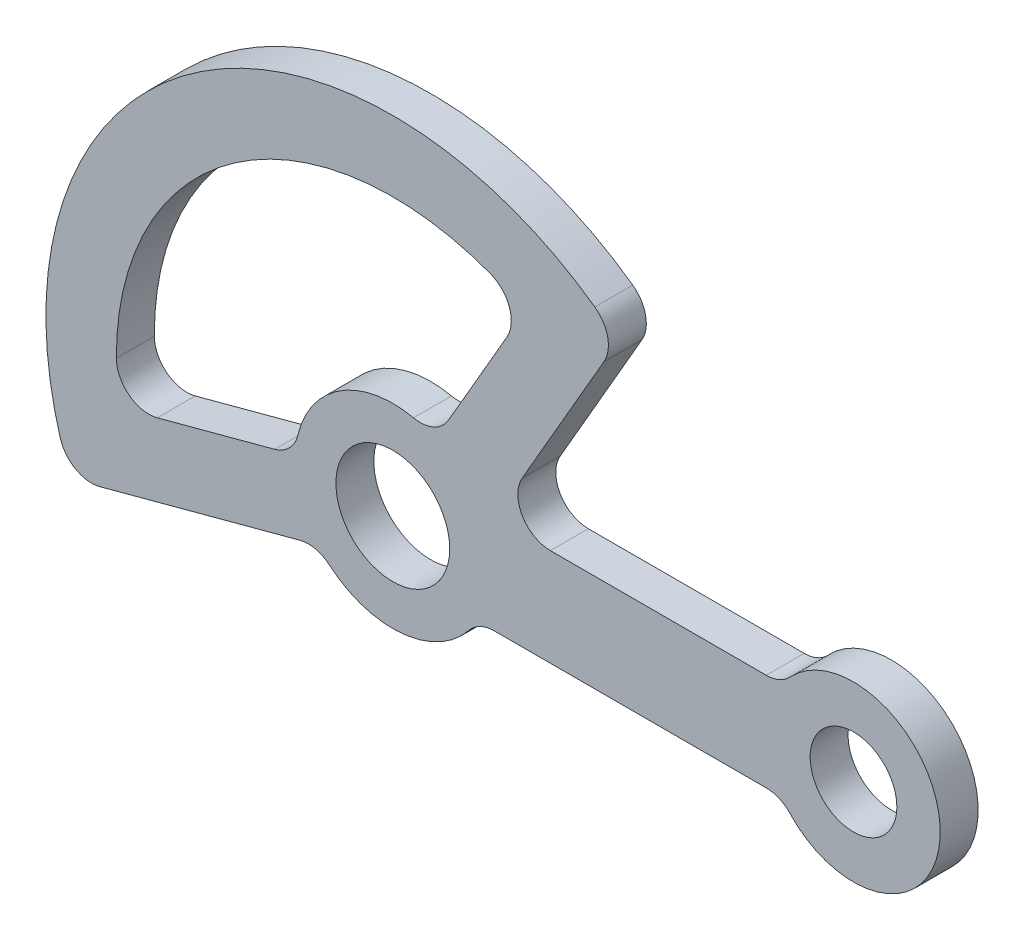
ISO-10303-21;
HEADER;
FILE_DESCRIPTION(('STEP AP214'),'2;1');
FILE_NAME('part.step','',(''),(''),'','','');
FILE_SCHEMA(('AUTOMOTIVE_DESIGN { 1 0 10303 214 1 1 1 1 }'));
ENDSEC;
DATA;
#1=APPLICATION_CONTEXT('core data for automotive mechanical design processes');
#2=APPLICATION_PROTOCOL_DEFINITION('international standard','automotive_design',2000,#1);
#3=PRODUCT_CONTEXT('',#1,'mechanical');
#4=PRODUCT('Part','Part','',(#3));
#5=PRODUCT_RELATED_PRODUCT_CATEGORY('part','',(#4));
#6=PRODUCT_DEFINITION_FORMATION('','',#4);
#7=PRODUCT_DEFINITION_CONTEXT('part definition',#1,'design');
#8=PRODUCT_DEFINITION('design','',#6,#7);
#9=PRODUCT_DEFINITION_SHAPE('','',#8);
#10=(LENGTH_UNIT() NAMED_UNIT(*) SI_UNIT(.MILLI.,.METRE.));
#11=(NAMED_UNIT(*) PLANE_ANGLE_UNIT() SI_UNIT($,.RADIAN.));
#12=(NAMED_UNIT(*) SI_UNIT($,.STERADIAN.) SOLID_ANGLE_UNIT());
#13=UNCERTAINTY_MEASURE_WITH_UNIT(LENGTH_MEASURE(1.E-05),#10,'distance_accuracy_value','');
#14=(GEOMETRIC_REPRESENTATION_CONTEXT(3) GLOBAL_UNCERTAINTY_ASSIGNED_CONTEXT((#13)) GLOBAL_UNIT_ASSIGNED_CONTEXT((#10,
#11,#12)) REPRESENTATION_CONTEXT('',''));
#15=CARTESIAN_POINT('',(0.,0.,0.));
#16=DIRECTION('',(0.,0.,1.));
#17=DIRECTION('',(1.,0.,0.));
#18=AXIS2_PLACEMENT_3D('',#15,#16,#17);
#19=CARTESIAN_POINT('',(0.,0.,7.));
#20=DIRECTION('',(0.,0.,-1.));
#21=DIRECTION('',(-1.,0.,0.));
#22=AXIS2_PLACEMENT_3D('',#19,#20,#21);
#23=CYLINDRICAL_SURFACE('',#22,18.);
#24=CARTESIAN_POINT('',(0.,0.,0.));
#25=DIRECTION('',(0.,0.,1.));
#26=DIRECTION('',(1.,0.,0.));
#27=AXIS2_PLACEMENT_3D('',#24,#25,#26);
#28=CIRCLE('',#27,18.);
#29=CARTESIAN_POINT('',(-11.689775819506,-13.6875542479178,0.));
#30=VERTEX_POINT('',#29);
#31=CARTESIAN_POINT('',(14.0512454963964,-11.25,0.));
#32=VERTEX_POINT('',#31);
#33=EDGE_CURVE('E251',#30,#32,#28,.T.);
#34=ORIENTED_EDGE('',*,*,#33,.T.);
#35=DIRECTION('',(0.,0.,-1.));
#36=VECTOR('',#35,1.);
#37=CARTESIAN_POINT('',(14.0512454963964,-11.25,7.));
#38=LINE('',#37,#36);
#39=CARTESIAN_POINT('',(14.0512454963964,-11.25,7.));
#40=VERTEX_POINT('',#39);
#41=EDGE_CURVE('E11',#40,#32,#38,.T.);
#42=ORIENTED_EDGE('',*,*,#41,.F.);
#43=CARTESIAN_POINT('',(0.,0.,7.));
#44=DIRECTION('',(0.,0.,1.));
#45=DIRECTION('',(1.,0.,0.));
#46=AXIS2_PLACEMENT_3D('',#43,#44,#45);
#47=CIRCLE('',#46,18.);
#48=CARTESIAN_POINT('',(-11.689775819506,-13.6875542479178,7.));
#49=VERTEX_POINT('',#48);
#50=EDGE_CURVE('E431',#49,#40,#47,.T.);
#51=ORIENTED_EDGE('',*,*,#50,.F.);
#52=DIRECTION('',(0.,0.,-1.));
#53=VECTOR('',#52,1.);
#54=CARTESIAN_POINT('',(-11.689775819506,-13.6875542479178,7.));
#55=LINE('',#54,#53);
#56=EDGE_CURVE('E323',#49,#30,#55,.T.);
#57=ORIENTED_EDGE('',*,*,#56,.T.);
#58=EDGE_LOOP('',(#34,#42,#51,#57));
#59=FACE_BOUND('',#58,.T.);
#60=ADVANCED_FACE('F45',(#59),#23,.T.);
#61=CARTESIAN_POINT('',(18.7349939951952,-15.,7.));
#62=DIRECTION('',(0.,0.,-1.));
#63=DIRECTION('',(-1.,0.,0.));
#64=AXIS2_PLACEMENT_3D('',#61,#62,#63);
#65=CYLINDRICAL_SURFACE('',#64,6.);
#66=CARTESIAN_POINT('',(18.7349939951952,-15.,0.));
#67=DIRECTION('',(0.,0.,1.));
#68=DIRECTION('',(1.,0.,0.));
#69=AXIS2_PLACEMENT_3D('',#66,#67,#68);
#70=CIRCLE('',#69,6.);
#71=CARTESIAN_POINT('',(18.7349939951952,-9.,0.));
#72=VERTEX_POINT('',#71);
#73=EDGE_CURVE('E274',#72,#32,#70,.T.);
#74=ORIENTED_EDGE('',*,*,#73,.F.);
#75=DIRECTION('',(0.,0.,-1.));
#76=VECTOR('',#75,1.);
#77=CARTESIAN_POINT('',(18.7349939951952,-9.,7.));
#78=LINE('',#77,#76);
#79=CARTESIAN_POINT('',(18.7349939951952,-9.,7.));
#80=VERTEX_POINT('',#79);
#81=EDGE_CURVE('E56',#80,#72,#78,.T.);
#82=ORIENTED_EDGE('',*,*,#81,.F.);
#83=CARTESIAN_POINT('',(18.7349939951952,-15.,7.));
#84=DIRECTION('',(0.,0.,1.));
#85=DIRECTION('',(1.,0.,0.));
#86=AXIS2_PLACEMENT_3D('',#83,#84,#85);
#87=CIRCLE('',#86,6.);
#88=EDGE_CURVE('E443',#80,#40,#87,.T.);
#89=ORIENTED_EDGE('',*,*,#88,.T.);
#90=ORIENTED_EDGE('',*,*,#41,.T.);
#91=EDGE_LOOP('',(#74,#82,#89,#90));
#92=FACE_BOUND('',#91,.T.);
#93=ADVANCED_FACE('F482',(#92),#65,.F.);
#94=CARTESIAN_POINT('',(0.,-9.,7.));
#95=DIRECTION('',(0.,1.,0.));
#96=DIRECTION('',(-1.,0.,0.));
#97=AXIS2_PLACEMENT_3D('',#94,#95,#96);
#98=PLANE('',#97);
#99=DIRECTION('',(1.,0.,0.));
#100=VECTOR('',#99,1.);
#101=CARTESIAN_POINT('',(0.,-9.,0.));
#102=LINE('',#101,#100);
#103=CARTESIAN_POINT('',(68.9065230605689,-9.,0.));
#104=VERTEX_POINT('',#103);
#105=EDGE_CURVE('E278',#72,#104,#102,.T.);
#106=ORIENTED_EDGE('',*,*,#105,.T.);
#107=DIRECTION('',(0.,0.,-1.));
#108=VECTOR('',#107,1.);
#109=CARTESIAN_POINT('',(68.9065230605689,-9.,7.));
#110=LINE('',#109,#108);
#111=CARTESIAN_POINT('',(68.9065230605689,-9.,7.));
#112=VERTEX_POINT('',#111);
#113=EDGE_CURVE('E355',#112,#104,#110,.T.);
#114=ORIENTED_EDGE('',*,*,#113,.F.);
#115=DIRECTION('',(1.,0.,0.));
#116=VECTOR('',#115,1.);
#117=CARTESIAN_POINT('',(0.,-9.,7.));
#118=LINE('',#117,#116);
#119=EDGE_CURVE('E447',#80,#112,#118,.T.);
#120=ORIENTED_EDGE('',*,*,#119,.F.);
#121=ORIENTED_EDGE('',*,*,#81,.T.);
#122=EDGE_LOOP('',(#106,#114,#120,#121));
#123=FACE_BOUND('',#122,.T.);
#124=ADVANCED_FACE('F487',(#123),#98,.F.);
#125=CARTESIAN_POINT('',(68.9065230605689,-15.,7.));
#126=DIRECTION('',(0.,0.,-1.));
#127=DIRECTION('',(-1.,0.,0.));
#128=AXIS2_PLACEMENT_3D('',#125,#126,#127);
#129=CYLINDRICAL_SURFACE('',#128,6.);
#130=CARTESIAN_POINT('',(68.9065230605689,-15.,0.));
#131=DIRECTION('',(0.,0.,1.));
#132=DIRECTION('',(1.,0.,0.));
#133=AXIS2_PLACEMENT_3D('',#130,#131,#132);
#134=CIRCLE('',#133,6.);
#135=CARTESIAN_POINT('',(73.2956531349592,-10.9090909090909,0.));
#136=VERTEX_POINT('',#135);
#137=EDGE_CURVE('E281',#104,#136,#134,.F.);
#138=ORIENTED_EDGE('',*,*,#137,.T.);
#139=DIRECTION('',(0.,0.,-1.));
#140=VECTOR('',#139,1.);
#141=CARTESIAN_POINT('',(73.2956531349592,-10.9090909090909,7.));
#142=LINE('',#141,#140);
#143=CARTESIAN_POINT('',(73.2956531349592,-10.9090909090909,7.));
#144=VERTEX_POINT('',#143);
#145=EDGE_CURVE('E351',#144,#136,#142,.T.);
#146=ORIENTED_EDGE('',*,*,#145,.F.);
#147=CARTESIAN_POINT('',(68.9065230605689,-15.,7.));
#148=DIRECTION('',(0.,0.,1.));
#149=DIRECTION('',(1.,0.,0.));
#150=AXIS2_PLACEMENT_3D('',#147,#148,#149);
#151=CIRCLE('',#150,6.);
#152=EDGE_CURVE('E450',#112,#144,#151,.F.);
#153=ORIENTED_EDGE('',*,*,#152,.F.);
#154=ORIENTED_EDGE('',*,*,#113,.T.);
#155=EDGE_LOOP('',(#138,#146,#153,#154));
#156=FACE_BOUND('',#155,.T.);
#157=ADVANCED_FACE('F494',(#156),#129,.F.);
#158=CARTESIAN_POINT('',(85.,0.,7.));
#159=DIRECTION('',(0.,0.,-1.));
#160=DIRECTION('',(-1.,0.,0.));
#161=AXIS2_PLACEMENT_3D('',#158,#159,#160);
#162=CYLINDRICAL_SURFACE('',#161,16.);
#163=CARTESIAN_POINT('',(85.,0.,0.));
#164=DIRECTION('',(0.,0.,1.));
#165=DIRECTION('',(1.,0.,0.));
#166=AXIS2_PLACEMENT_3D('',#163,#164,#165);
#167=CIRCLE('',#166,16.);
#168=CARTESIAN_POINT('',(73.2956531349592,10.9090909090909,0.));
#169=VERTEX_POINT('',#168);
#170=EDGE_CURVE('E284',#136,#169,#167,.T.);
#171=ORIENTED_EDGE('',*,*,#170,.T.);
#172=DIRECTION('',(0.,0.,-1.));
#173=VECTOR('',#172,1.);
#174=CARTESIAN_POINT('',(73.2956531349592,10.9090909090909,7.));
#175=LINE('',#174,#173);
#176=CARTESIAN_POINT('',(73.2956531349592,10.9090909090909,7.));
#177=VERTEX_POINT('',#176);
#178=EDGE_CURVE('E348',#177,#169,#175,.T.);
#179=ORIENTED_EDGE('',*,*,#178,.F.);
#180=CARTESIAN_POINT('',(85.,0.,7.));
#181=DIRECTION('',(0.,0.,1.));
#182=DIRECTION('',(1.,0.,0.));
#183=AXIS2_PLACEMENT_3D('',#180,#181,#182);
#184=CIRCLE('',#183,16.);
#185=EDGE_CURVE('E453',#144,#177,#184,.T.);
#186=ORIENTED_EDGE('',*,*,#185,.F.);
#187=ORIENTED_EDGE('',*,*,#145,.T.);
#188=EDGE_LOOP('',(#171,#179,#186,#187));
#189=FACE_BOUND('',#188,.T.);
#190=ADVANCED_FACE('F498',(#189),#162,.T.);
#191=CARTESIAN_POINT('',(68.9065230605689,15.,7.));
#192=DIRECTION('',(0.,0.,-1.));
#193=DIRECTION('',(-1.,0.,0.));
#194=AXIS2_PLACEMENT_3D('',#191,#192,#193);
#195=CYLINDRICAL_SURFACE('',#194,6.00000000000001);
#196=CARTESIAN_POINT('',(68.9065230605689,15.,0.));
#197=DIRECTION('',(0.,0.,1.));
#198=DIRECTION('',(1.,0.,0.));
#199=AXIS2_PLACEMENT_3D('',#196,#197,#198);
#200=CIRCLE('',#199,6.00000000000001);
#201=CARTESIAN_POINT('',(68.9065230605689,9.,0.));
#202=VERTEX_POINT('',#201);
#203=EDGE_CURVE('E288',#202,#169,#200,.T.);
#204=ORIENTED_EDGE('',*,*,#203,.F.);
#205=DIRECTION('',(0.,0.,-1.));
#206=VECTOR('',#205,1.);
#207=CARTESIAN_POINT('',(68.9065230605689,9.,7.));
#208=LINE('',#207,#206);
#209=CARTESIAN_POINT('',(68.9065230605689,9.,7.));
#210=VERTEX_POINT('',#209);
#211=EDGE_CURVE('E345',#210,#202,#208,.T.);
#212=ORIENTED_EDGE('',*,*,#211,.F.);
#213=CARTESIAN_POINT('',(68.9065230605689,15.,7.));
#214=DIRECTION('',(0.,0.,1.));
#215=DIRECTION('',(1.,0.,0.));
#216=AXIS2_PLACEMENT_3D('',#213,#214,#215);
#217=CIRCLE('',#216,6.00000000000001);
#218=EDGE_CURVE('E456',#210,#177,#217,.T.);
#219=ORIENTED_EDGE('',*,*,#218,.T.);
#220=ORIENTED_EDGE('',*,*,#178,.T.);
#221=EDGE_LOOP('',(#204,#212,#219,#220));
#222=FACE_BOUND('',#221,.T.);
#223=ADVANCED_FACE('F501',(#222),#195,.F.);
#224=CARTESIAN_POINT('',(0.,9.,7.));
#225=DIRECTION('',(0.,1.,0.));
#226=DIRECTION('',(-1.,0.,0.));
#227=AXIS2_PLACEMENT_3D('',#224,#225,#226);
#228=PLANE('',#227);
#229=DIRECTION('',(1.,0.,0.));
#230=VECTOR('',#229,1.);
#231=CARTESIAN_POINT('',(0.,9.,0.));
#232=LINE('',#231,#230);
#233=CARTESIAN_POINT('',(29.0715098264214,9.,0.));
#234=VERTEX_POINT('',#233);
#235=EDGE_CURVE('E292',#234,#202,#232,.T.);
#236=ORIENTED_EDGE('',*,*,#235,.F.);
#237=DIRECTION('',(0.,0.,-1.));
#238=VECTOR('',#237,1.);
#239=CARTESIAN_POINT('',(29.0715098264214,9.,7.));
#240=LINE('',#239,#238);
#241=CARTESIAN_POINT('',(29.0715098264214,9.,7.));
#242=VERTEX_POINT('',#241);
#243=EDGE_CURVE('E342',#242,#234,#240,.T.);
#244=ORIENTED_EDGE('',*,*,#243,.F.);
#245=DIRECTION('',(1.,0.,0.));
#246=VECTOR('',#245,1.);
#247=CARTESIAN_POINT('',(0.,9.,7.));
#248=LINE('',#247,#246);
#249=EDGE_CURVE('E460',#242,#210,#248,.T.);
#250=ORIENTED_EDGE('',*,*,#249,.T.);
#251=ORIENTED_EDGE('',*,*,#211,.T.);
#252=EDGE_LOOP('',(#236,#244,#250,#251));
#253=FACE_BOUND('',#252,.T.);
#254=ADVANCED_FACE('F505',(#253),#228,.T.);
#255=CARTESIAN_POINT('',(29.0715098264214,15.,7.));
#256=DIRECTION('',(0.,0.,-1.));
#257=DIRECTION('',(-1.,0.,0.));
#258=AXIS2_PLACEMENT_3D('',#255,#256,#257);
#259=CYLINDRICAL_SURFACE('',#258,5.99999999999997);
#260=CARTESIAN_POINT('',(29.0715098264214,15.,0.));
#261=DIRECTION('',(0.,0.,1.));
#262=DIRECTION('',(1.,0.,0.));
#263=AXIS2_PLACEMENT_3D('',#260,#261,#262);
#264=CIRCLE('',#263,5.99999999999997);
#265=CARTESIAN_POINT('',(23.8753574037148,18.,0.));
#266=VERTEX_POINT('',#265);
#267=EDGE_CURVE('E296',#234,#266,#264,.F.);
#268=ORIENTED_EDGE('',*,*,#267,.T.);
#269=DIRECTION('',(0.,0.,-1.));
#270=VECTOR('',#269,1.);
#271=CARTESIAN_POINT('',(23.8753574037148,18.,7.));
#272=LINE('',#271,#270);
#273=CARTESIAN_POINT('',(23.8753574037148,18.,7.));
#274=VERTEX_POINT('',#273);
#275=EDGE_CURVE('E338',#274,#266,#272,.T.);
#276=ORIENTED_EDGE('',*,*,#275,.F.);
#277=CARTESIAN_POINT('',(29.0715098264214,15.,7.));
#278=DIRECTION('',(0.,0.,1.));
#279=DIRECTION('',(1.,0.,0.));
#280=AXIS2_PLACEMENT_3D('',#277,#278,#279);
#281=CIRCLE('',#280,5.99999999999997);
#282=EDGE_CURVE('E464',#242,#274,#281,.F.);
#283=ORIENTED_EDGE('',*,*,#282,.F.);
#284=ORIENTED_EDGE('',*,*,#243,.T.);
#285=EDGE_LOOP('',(#268,#276,#283,#284));
#286=FACE_BOUND('',#285,.T.);
#287=ADVANCED_FACE('F510',(#286),#259,.F.);
#288=CARTESIAN_POINT('',(10.1122894187262,-5.83833301802497,7.));
#289=DIRECTION('',(-0.866025403784438,0.500000000000001,0.));
#290=DIRECTION('',(-0.500000000000001,-0.866025403784438,0.));
#291=AXIS2_PLACEMENT_3D('',#288,#289,#290);
#292=PLANE('',#291);
#293=DIRECTION('',(0.500000000000001,0.866025403784438,0.));
#294=VECTOR('',#293,1.);
#295=CARTESIAN_POINT('',(10.1122894187262,-5.83833301802497,0.));
#296=LINE('',#295,#294);
#297=CARTESIAN_POINT('',(38.9730563121889,44.1499815868541,0.));
#298=VERTEX_POINT('',#297);
#299=EDGE_CURVE('E299',#266,#298,#296,.T.);
#300=ORIENTED_EDGE('',*,*,#299,.T.);
#301=DIRECTION('',(0.,0.,-1.));
#302=VECTOR('',#301,1.);
#303=CARTESIAN_POINT('',(38.9730563121889,44.1499815868541,7.));
#304=LINE('',#303,#302);
#305=CARTESIAN_POINT('',(38.9730563121889,44.1499815868541,7.));
#306=VERTEX_POINT('',#305);
#307=EDGE_CURVE('E334',#306,#298,#304,.T.);
#308=ORIENTED_EDGE('',*,*,#307,.F.);
#309=DIRECTION('',(0.500000000000001,0.866025403784438,0.));
#310=VECTOR('',#309,1.);
#311=CARTESIAN_POINT('',(10.1122894187262,-5.83833301802497,7.));
#312=LINE('',#311,#310);
#313=EDGE_CURVE('E467',#274,#306,#312,.T.);
#314=ORIENTED_EDGE('',*,*,#313,.F.);
#315=ORIENTED_EDGE('',*,*,#275,.T.);
#316=EDGE_LOOP('',(#300,#308,#314,#315));
#317=FACE_BOUND('',#316,.T.);
#318=ADVANCED_FACE('F516',(#317),#292,.F.);
#319=CARTESIAN_POINT('',(33.7769038894822,47.1499815868541,7.));
#320=DIRECTION('',(0.,0.,-1.));
#321=DIRECTION('',(-1.,0.,0.));
#322=AXIS2_PLACEMENT_3D('',#319,#320,#321);
#323=CYLINDRICAL_SURFACE('',#322,6.00000000000003);
#324=CARTESIAN_POINT('',(33.7769038894822,47.1499815868541,0.));
#325=DIRECTION('',(0.,0.,1.));
#326=DIRECTION('',(1.,0.,0.));
#327=AXIS2_PLACEMENT_3D('',#324,#325,#326);
#328=CIRCLE('',#327,6.00000000000003);
#329=CARTESIAN_POINT('',(37.2710663608079,52.0275658889425,0.));
#330=VERTEX_POINT('',#329);
#331=EDGE_CURVE('E302',#298,#330,#328,.T.);
#332=ORIENTED_EDGE('',*,*,#331,.T.);
#333=DIRECTION('',(0.,0.,-1.));
#334=VECTOR('',#333,1.);
#335=CARTESIAN_POINT('',(37.2710663608079,52.0275658889425,7.));
#336=LINE('',#335,#334);
#337=CARTESIAN_POINT('',(37.2710663608079,52.0275658889425,7.));
#338=VERTEX_POINT('',#337);
#339=EDGE_CURVE('E330',#338,#330,#336,.T.);
#340=ORIENTED_EDGE('',*,*,#339,.F.);
#341=CARTESIAN_POINT('',(33.7769038894822,47.1499815868541,7.));
#342=DIRECTION('',(0.,0.,1.));
#343=DIRECTION('',(1.,0.,0.));
#344=AXIS2_PLACEMENT_3D('',#341,#342,#343);
#345=CIRCLE('',#344,6.00000000000003);
#346=EDGE_CURVE('E470',#306,#338,#345,.T.);
#347=ORIENTED_EDGE('',*,*,#346,.F.);
#348=ORIENTED_EDGE('',*,*,#307,.T.);
#349=EDGE_LOOP('',(#332,#340,#347,#348));
#350=FACE_BOUND('',#349,.T.);
#351=ADVANCED_FACE('F520',(#350),#323,.T.);
#352=CARTESIAN_POINT('',(0.,0.,7.));
#353=DIRECTION('',(0.,0.,-1.));
#354=DIRECTION('',(-1.,0.,0.));
#355=AXIS2_PLACEMENT_3D('',#352,#353,#354);
#356=CYLINDRICAL_SURFACE('',#355,64.);
#357=CARTESIAN_POINT('',(0.,0.,0.));
#358=DIRECTION('',(0.,0.,1.));
#359=DIRECTION('',(1.,0.,0.));
#360=AXIS2_PLACEMENT_3D('',#357,#358,#359);
#361=CIRCLE('',#360,64.);
#362=CARTESIAN_POINT('',(-61.3406137368719,-18.2573028233603,0.));
#363=VERTEX_POINT('',#362);
#364=EDGE_CURVE('E305',#330,#363,#361,.T.);
#365=ORIENTED_EDGE('',*,*,#364,.T.);
#366=DIRECTION('',(0.,0.,-1.));
#367=VECTOR('',#366,1.);
#368=CARTESIAN_POINT('',(-61.3406137368719,-18.2573028233603,7.));
#369=LINE('',#368,#367);
#370=CARTESIAN_POINT('',(-61.3406137368719,-18.2573028233603,7.));
#371=VERTEX_POINT('',#370);
#372=EDGE_CURVE('E223',#371,#363,#369,.T.);
#373=ORIENTED_EDGE('',*,*,#372,.F.);
#374=CARTESIAN_POINT('',(0.,0.,7.));
#375=DIRECTION('',(0.,0.,1.));
#376=DIRECTION('',(1.,0.,0.));
#377=AXIS2_PLACEMENT_3D('',#374,#375,#376);
#378=CIRCLE('',#377,64.);
#379=EDGE_CURVE('E212',#338,#371,#378,.T.);
#380=ORIENTED_EDGE('',*,*,#379,.F.);
#381=ORIENTED_EDGE('',*,*,#339,.T.);
#382=EDGE_LOOP('',(#365,#373,#380,#381));
#383=FACE_BOUND('',#382,.T.);
#384=ADVANCED_FACE('F523',(#383),#356,.T.);
#385=CARTESIAN_POINT('',(-55.5899311990402,-16.5456806836703,7.));
#386=DIRECTION('',(0.,0.,-1.));
#387=DIRECTION('',(-1.,0.,0.));
#388=AXIS2_PLACEMENT_3D('',#385,#386,#387);
#389=CYLINDRICAL_SURFACE('',#388,6.00000000000001);
#390=CARTESIAN_POINT('',(-55.5899311990402,-16.5456806836703,0.));
#391=DIRECTION('',(0.,0.,1.));
#392=DIRECTION('',(1.,0.,0.));
#393=AXIS2_PLACEMENT_3D('',#390,#391,#392);
#394=CIRCLE('',#393,6.00000000000001);
#395=CARTESIAN_POINT('',(-54.0370169284251,-22.3412356414047,0.));
#396=VERTEX_POINT('',#395);
#397=EDGE_CURVE('E221',#363,#396,#394,.T.);
#398=ORIENTED_EDGE('',*,*,#397,.T.);
#399=DIRECTION('',(0.,0.,-1.));
#400=VECTOR('',#399,1.);
#401=CARTESIAN_POINT('',(-54.0370169284251,-22.3412356414047,7.));
#402=LINE('',#401,#400);
#403=CARTESIAN_POINT('',(-54.0370169284251,-22.3412356414047,7.));
#404=VERTEX_POINT('',#403);
#405=EDGE_CURVE('E218',#404,#396,#402,.T.);
#406=ORIENTED_EDGE('',*,*,#405,.F.);
#407=CARTESIAN_POINT('',(-55.5899311990402,-16.5456806836703,7.));
#408=DIRECTION('',(0.,0.,1.));
#409=DIRECTION('',(1.,0.,0.));
#410=AXIS2_PLACEMENT_3D('',#407,#408,#409);
#411=CIRCLE('',#410,6.00000000000001);
#412=EDGE_CURVE('E205',#371,#404,#411,.T.);
#413=ORIENTED_EDGE('',*,*,#412,.F.);
#414=ORIENTED_EDGE('',*,*,#372,.T.);
#415=EDGE_LOOP('',(#398,#406,#413,#414));
#416=FACE_BOUND('',#415,.T.);
#417=ADVANCED_FACE('F219',(#416),#389,.T.);
#418=CARTESIAN_POINT('',(1.96551514851162,-7.33540239729182,7.));
#419=DIRECTION('',(-0.258819045102515,0.96592582628907,0.));
#420=DIRECTION('',(-0.96592582628907,-0.258819045102515,0.));
#421=AXIS2_PLACEMENT_3D('',#418,#419,#420);
#422=PLANE('',#421);
#423=DIRECTION('',(0.96592582628907,0.258819045102515,0.));
#424=VECTOR('',#423,1.);
#425=CARTESIAN_POINT('',(1.96551514851162,-7.33540239729182,0.));
#426=LINE('',#425,#424);
#427=CARTESIAN_POINT('',(-17.1392820299565,-12.4545173728226,0.));
#428=VERTEX_POINT('',#427);
#429=EDGE_CURVE('E135',#396,#428,#426,.T.);
#430=ORIENTED_EDGE('',*,*,#429,.T.);
#431=DIRECTION('',(0.,0.,-1.));
#432=VECTOR('',#431,1.);
#433=CARTESIAN_POINT('',(-17.1392820299565,-12.4545173728226,7.));
#434=LINE('',#433,#432);
#435=CARTESIAN_POINT('',(-17.1392820299565,-12.4545173728226,7.));
#436=VERTEX_POINT('',#435);
#437=EDGE_CURVE('E224',#436,#428,#434,.T.);
#438=ORIENTED_EDGE('',*,*,#437,.F.);
#439=DIRECTION('',(0.96592582628907,0.258819045102515,0.));
#440=VECTOR('',#439,1.);
#441=CARTESIAN_POINT('',(1.96551514851162,-7.33540239729182,7.));
#442=LINE('',#441,#440);
#443=EDGE_CURVE('E210',#404,#436,#442,.T.);
#444=ORIENTED_EDGE('',*,*,#443,.F.);
#445=ORIENTED_EDGE('',*,*,#405,.T.);
#446=EDGE_LOOP('',(#430,#438,#444,#445));
#447=FACE_BOUND('',#446,.T.);
#448=ADVANCED_FACE('F226',(#447),#422,.F.);
#449=CARTESIAN_POINT('',(5.08550095488993,23.4550139637096,7.));
#450=DIRECTION('',(0.,0.,-1.));
#451=DIRECTION('',(-1.,0.,0.));
#452=AXIS2_PLACEMENT_3D('',#449,#450,#451);
#453=CYLINDRICAL_SURFACE('',#452,6.00000000000003);
#454=CARTESIAN_POINT('',(5.08550095488993,23.4550139637096,0.));
#455=DIRECTION('',(0.,0.,1.));
#456=DIRECTION('',(1.,0.,0.));
#457=AXIS2_PLACEMENT_3D('',#454,#455,#456);
#458=CIRCLE('',#457,6.00000000000003);
#459=CARTESIAN_POINT('',(10.2816533775966,20.4550139637096,0.));
#460=VERTEX_POINT('',#459);
#461=CARTESIAN_POINT('',(3.81412571616744,17.5912604727822,0.));
#462=VERTEX_POINT('',#461);
#463=EDGE_CURVE('E242',#460,#462,#458,.F.);
#464=ORIENTED_EDGE('',*,*,#463,.T.);
#465=DIRECTION('',(0.,0.,-1.));
#466=VECTOR('',#465,1.);
#467=CARTESIAN_POINT('',(3.81412571616744,17.5912604727822,7.));
#468=LINE('',#467,#466);
#469=CARTESIAN_POINT('',(3.81412571616744,17.5912604727822,7.));
#470=VERTEX_POINT('',#469);
#471=EDGE_CURVE('E49',#470,#462,#468,.T.);
#472=ORIENTED_EDGE('',*,*,#471,.F.);
#473=CARTESIAN_POINT('',(5.08550095488993,23.4550139637096,7.));
#474=DIRECTION('',(0.,0.,1.));
#475=DIRECTION('',(1.,0.,0.));
#476=AXIS2_PLACEMENT_3D('',#473,#474,#475);
#477=CIRCLE('',#476,6.00000000000003);
#478=CARTESIAN_POINT('',(10.2816533775966,20.4550139637096,7.));
#479=VERTEX_POINT('',#478);
#480=EDGE_CURVE('E322',#479,#470,#477,.F.);
#481=ORIENTED_EDGE('',*,*,#480,.F.);
#482=DIRECTION('',(0.,0.,-1.));
#483=VECTOR('',#482,1.);
#484=CARTESIAN_POINT('',(10.2816533775966,20.4550139637096,7.));
#485=LINE('',#484,#483);
#486=EDGE_CURVE('E241',#479,#460,#485,.T.);
#487=ORIENTED_EDGE('',*,*,#486,.T.);
#488=EDGE_LOOP('',(#464,#472,#481,#487));
#489=FACE_BOUND('',#488,.T.);
#490=ADVANCED_FACE('F47',(#489),#453,.F.);
#491=CARTESIAN_POINT('',(-17.5117715955913,4.16387506823185,0.));
#492=VERTEX_POINT('',#491);
#493=EDGE_CURVE('E246',#462,#492,#28,.T.);
#494=ORIENTED_EDGE('',*,*,#493,.T.);
#495=DIRECTION('',(0.,0.,-1.));
#496=VECTOR('',#495,1.);
#497=CARTESIAN_POINT('',(-17.5117715955913,4.16387506823185,7.));
#498=LINE('',#497,#496);
#499=CARTESIAN_POINT('',(-17.5117715955913,4.16387506823185,7.));
#500=VERTEX_POINT('',#499);
#501=EDGE_CURVE('E378',#500,#492,#498,.T.);
#502=ORIENTED_EDGE('',*,*,#501,.F.);
#503=EDGE_CURVE('E150',#470,#500,#47,.T.);
#504=ORIENTED_EDGE('',*,*,#503,.F.);
#505=ORIENTED_EDGE('',*,*,#471,.T.);
#506=EDGE_LOOP('',(#494,#502,#504,#505));
#507=FACE_BOUND('',#506,.T.);
#508=ADVANCED_FACE('F385',(#507),#23,.T.);
#509=CARTESIAN_POINT('',(-23.3490287941217,5.55183342430913,7.));
#510=DIRECTION('',(0.,0.,-1.));
#511=DIRECTION('',(-1.,0.,0.));
#512=AXIS2_PLACEMENT_3D('',#509,#510,#511);
#513=CYLINDRICAL_SURFACE('',#512,6.);
#514=CARTESIAN_POINT('',(-23.3490287941217,5.55183342430913,0.));
#515=DIRECTION('',(0.,0.,1.));
#516=DIRECTION('',(1.,0.,0.));
#517=AXIS2_PLACEMENT_3D('',#514,#515,#516);
#518=CIRCLE('',#517,6.);
#519=CARTESIAN_POINT('',(-21.7961145235066,-0.243721533425292,0.));
#520=VERTEX_POINT('',#519);
#521=EDGE_CURVE('E250',#520,#492,#518,.T.);
#522=ORIENTED_EDGE('',*,*,#521,.F.);
#523=DIRECTION('',(0.,0.,-1.));
#524=VECTOR('',#523,1.);
#525=CARTESIAN_POINT('',(-21.7961145235066,-0.243721533425292,7.));
#526=LINE('',#525,#524);
#527=CARTESIAN_POINT('',(-21.7961145235066,-0.243721533425292,7.));
#528=VERTEX_POINT('',#527);
#529=EDGE_CURVE('E376',#528,#520,#526,.T.);
#530=ORIENTED_EDGE('',*,*,#529,.F.);
#531=CARTESIAN_POINT('',(-23.3490287941217,5.55183342430913,7.));
#532=DIRECTION('',(0.,0.,1.));
#533=DIRECTION('',(1.,0.,0.));
#534=AXIS2_PLACEMENT_3D('',#531,#532,#533);
#535=CIRCLE('',#534,6.);
#536=EDGE_CURVE('E423',#528,#500,#535,.T.);
#537=ORIENTED_EDGE('',*,*,#536,.T.);
#538=ORIENTED_EDGE('',*,*,#501,.T.);
#539=EDGE_LOOP('',(#522,#530,#537,#538));
#540=FACE_BOUND('',#539,.T.);
#541=ADVANCED_FACE('F421',(#540),#513,.F.);
#542=CARTESIAN_POINT('',(-1.39913243782107,5.22163334446608,7.));
#543=DIRECTION('',(-0.258819045102515,0.96592582628907,0.));
#544=DIRECTION('',(-0.96592582628907,-0.258819045102515,0.));
#545=AXIS2_PLACEMENT_3D('',#542,#543,#544);
#546=PLANE('',#545);
#547=DIRECTION('',(0.96592582628907,0.258819045102515,0.));
#548=VECTOR('',#547,1.);
#549=CARTESIAN_POINT('',(-1.39913243782107,5.22163334446608,0.));
#550=LINE('',#549,#548);
#551=CARTESIAN_POINT('',(-43.4463949318956,-6.04489668476033,0.));
#552=VERTEX_POINT('',#551);
#553=EDGE_CURVE('E255',#552,#520,#550,.T.);
#554=ORIENTED_EDGE('',*,*,#553,.F.);
#555=DIRECTION('',(0.,0.,-1.));
#556=VECTOR('',#555,1.);
#557=CARTESIAN_POINT('',(-43.4463949318956,-6.04489668476033,7.));
#558=LINE('',#557,#556);
#559=CARTESIAN_POINT('',(-43.4463949318956,-6.04489668476033,7.));
#560=VERTEX_POINT('',#559);
#561=EDGE_CURVE('E373',#560,#552,#558,.T.);
#562=ORIENTED_EDGE('',*,*,#561,.F.);
#563=DIRECTION('',(0.96592582628907,0.258819045102515,0.));
#564=VECTOR('',#563,1.);
#565=CARTESIAN_POINT('',(-1.39913243782107,5.22163334446608,7.));
#566=LINE('',#565,#564);
#567=EDGE_CURVE('E420',#560,#528,#566,.T.);
#568=ORIENTED_EDGE('',*,*,#567,.T.);
#569=ORIENTED_EDGE('',*,*,#529,.T.);
#570=EDGE_LOOP('',(#554,#562,#568,#569));
#571=FACE_BOUND('',#570,.T.);
#572=ADVANCED_FACE('F419',(#571),#546,.T.);
#573=CARTESIAN_POINT('',(-44.9993092025107,-0.24934172702591,7.));
#574=DIRECTION('',(0.,0.,-1.));
#575=DIRECTION('',(-1.,0.,0.));
#576=AXIS2_PLACEMENT_3D('',#573,#574,#575);
#577=CYLINDRICAL_SURFACE('',#576,6.);
#578=CARTESIAN_POINT('',(-44.9993092025107,-0.24934172702591,0.));
#579=DIRECTION('',(0.,0.,1.));
#580=DIRECTION('',(1.,0.,0.));
#581=AXIS2_PLACEMENT_3D('',#578,#579,#580);
#582=CIRCLE('',#581,6.);
#583=CARTESIAN_POINT('',(-50.9992170961788,-0.282587290629364,0.));
#584=VERTEX_POINT('',#583);
#585=EDGE_CURVE('E259',#552,#584,#582,.F.);
#586=ORIENTED_EDGE('',*,*,#585,.T.);
#587=DIRECTION('',(0.,0.,-1.));
#588=VECTOR('',#587,1.);
#589=CARTESIAN_POINT('',(-50.9992170961788,-0.282587290629364,7.));
#590=LINE('',#589,#588);
#591=CARTESIAN_POINT('',(-50.9992170961788,-0.282587290629364,7.));
#592=VERTEX_POINT('',#591);
#593=EDGE_CURVE('E369',#592,#584,#590,.T.);
#594=ORIENTED_EDGE('',*,*,#593,.F.);
#595=CARTESIAN_POINT('',(-44.9993092025107,-0.24934172702591,7.));
#596=DIRECTION('',(0.,0.,1.));
#597=DIRECTION('',(1.,0.,0.));
#598=AXIS2_PLACEMENT_3D('',#595,#596,#597);
#599=CIRCLE('',#598,6.);
#600=EDGE_CURVE('E415',#560,#592,#599,.F.);
#601=ORIENTED_EDGE('',*,*,#600,.F.);
#602=ORIENTED_EDGE('',*,*,#561,.T.);
#603=EDGE_LOOP('',(#586,#594,#601,#602));
#604=FACE_BOUND('',#603,.T.);
#605=ADVANCED_FACE('F414',(#604),#577,.F.);
#606=CARTESIAN_POINT('',(0.,0.,7.));
#607=DIRECTION('',(0.,0.,-1.));
#608=DIRECTION('',(-1.,0.,0.));
#609=AXIS2_PLACEMENT_3D('',#606,#607,#608);
#610=CYLINDRICAL_SURFACE('',#609,51.);
#611=CARTESIAN_POINT('',(0.,0.,0.));
#612=DIRECTION('',(0.,0.,1.));
#613=DIRECTION('',(1.,0.,0.));
#614=AXIS2_PLACEMENT_3D('',#611,#612,#613);
#615=CIRCLE('',#614,51.);
#616=CARTESIAN_POINT('',(17.9722370059798,47.72838460498,0.));
#617=VERTEX_POINT('',#616);
#618=EDGE_CURVE('E262',#584,#617,#615,.F.);
#619=ORIENTED_EDGE('',*,*,#618,.T.);
#620=DIRECTION('',(0.,0.,-1.));
#621=VECTOR('',#620,1.);
#622=CARTESIAN_POINT('',(17.9722370059798,47.72838460498,7.));
#623=LINE('',#622,#621);
#624=CARTESIAN_POINT('',(17.9722370059798,47.72838460498,7.));
#625=VERTEX_POINT('',#624);
#626=EDGE_CURVE('E366',#625,#617,#623,.T.);
#627=ORIENTED_EDGE('',*,*,#626,.F.);
#628=CARTESIAN_POINT('',(0.,0.,7.));
#629=DIRECTION('',(0.,0.,1.));
#630=DIRECTION('',(1.,0.,0.));
#631=AXIS2_PLACEMENT_3D('',#628,#629,#630);
#632=CIRCLE('',#631,51.);
#633=EDGE_CURVE('E411',#592,#625,#632,.F.);
#634=ORIENTED_EDGE('',*,*,#633,.F.);
#635=ORIENTED_EDGE('',*,*,#593,.T.);
#636=EDGE_LOOP('',(#619,#627,#634,#635));
#637=FACE_BOUND('',#636,.T.);
#638=ADVANCED_FACE('F408',(#637),#610,.F.);
#639=CARTESIAN_POINT('',(15.8578561817468,42.1132805338059,7.));
#640=DIRECTION('',(0.,0.,-1.));
#641=DIRECTION('',(-1.,0.,0.));
#642=AXIS2_PLACEMENT_3D('',#639,#640,#641);
#643=CYLINDRICAL_SURFACE('',#642,6.00000000000002);
#644=CARTESIAN_POINT('',(15.8578561817468,42.1132805338059,0.));
#645=DIRECTION('',(0.,0.,1.));
#646=DIRECTION('',(1.,0.,0.));
#647=AXIS2_PLACEMENT_3D('',#644,#645,#646);
#648=CIRCLE('',#647,6.00000000000002);
#649=CARTESIAN_POINT('',(21.0540086044535,39.1132805338059,0.));
#650=VERTEX_POINT('',#649);
#651=EDGE_CURVE('E266',#650,#617,#648,.T.);
#652=ORIENTED_EDGE('',*,*,#651,.F.);
#653=DIRECTION('',(0.,0.,-1.));
#654=VECTOR('',#653,1.);
#655=CARTESIAN_POINT('',(21.0540086044535,39.1132805338059,7.));
#656=LINE('',#655,#654);
#657=CARTESIAN_POINT('',(21.0540086044535,39.1132805338059,7.));
#658=VERTEX_POINT('',#657);
#659=EDGE_CURVE('E363',#658,#650,#656,.T.);
#660=ORIENTED_EDGE('',*,*,#659,.F.);
#661=CARTESIAN_POINT('',(15.8578561817468,42.1132805338059,7.));
#662=DIRECTION('',(0.,0.,1.));
#663=DIRECTION('',(1.,0.,0.));
#664=AXIS2_PLACEMENT_3D('',#661,#662,#663);
#665=CIRCLE('',#664,6.00000000000002);
#666=EDGE_CURVE('E438',#658,#625,#665,.T.);
#667=ORIENTED_EDGE('',*,*,#666,.T.);
#668=ORIENTED_EDGE('',*,*,#626,.T.);
#669=EDGE_LOOP('',(#652,#660,#667,#668));
#670=FACE_BOUND('',#669,.T.);
#671=ADVANCED_FACE('F402',(#670),#643,.F.);
#672=CARTESIAN_POINT('',(0.,0.,7.));
#673=DIRECTION('',(0.,0.,-1.));
#674=DIRECTION('',(-1.,0.,0.));
#675=AXIS2_PLACEMENT_3D('',#672,#673,#674);
#676=CYLINDRICAL_SURFACE('',#675,10.5);
#677=CARTESIAN_POINT('',(0.,0.,7.));
#678=DIRECTION('',(0.,0.,1.));
#679=DIRECTION('',(1.,0.,0.));
#680=AXIS2_PLACEMENT_3D('',#677,#678,#679);
#681=CIRCLE('',#680,10.5);
#682=CARTESIAN_POINT('',(10.5,0.,7.));
#683=VERTEX_POINT('',#682);
#684=EDGE_CURVE('E230',#683,#683,#681,.T.);
#685=ORIENTED_EDGE('',*,*,#684,.T.);
#686=EDGE_LOOP('',(#685));
#687=FACE_BOUND('',#686,.T.);
#688=CARTESIAN_POINT('',(0.,0.,0.));
#689=DIRECTION('',(0.,0.,1.));
#690=DIRECTION('',(1.,0.,0.));
#691=AXIS2_PLACEMENT_3D('',#688,#689,#690);
#692=CIRCLE('',#691,10.5);
#693=CARTESIAN_POINT('',(10.5,0.,0.));
#694=VERTEX_POINT('',#693);
#695=EDGE_CURVE('E314',#694,#694,#692,.T.);
#696=ORIENTED_EDGE('',*,*,#695,.F.);
#697=EDGE_LOOP('',(#696));
#698=FACE_BOUND('',#697,.T.);
#699=ADVANCED_FACE('F682',(#687,#698),#676,.F.);
#700=CARTESIAN_POINT('',(-15.5863677593414,-18.250072330557,7.));
#701=DIRECTION('',(0.,0.,-1.));
#702=DIRECTION('',(-1.,0.,0.));
#703=AXIS2_PLACEMENT_3D('',#700,#701,#702);
#704=CYLINDRICAL_SURFACE('',#703,6.);
#705=CARTESIAN_POINT('',(-15.5863677593414,-18.250072330557,0.));
#706=DIRECTION('',(0.,0.,1.));
#707=DIRECTION('',(1.,0.,0.));
#708=AXIS2_PLACEMENT_3D('',#705,#706,#707);
#709=CIRCLE('',#708,6.);
#710=EDGE_CURVE('E141',#428,#30,#709,.F.);
#711=ORIENTED_EDGE('',*,*,#710,.T.);
#712=ORIENTED_EDGE('',*,*,#56,.F.);
#713=CARTESIAN_POINT('',(-15.5863677593414,-18.250072330557,7.));
#714=DIRECTION('',(0.,0.,1.));
#715=DIRECTION('',(1.,0.,0.));
#716=AXIS2_PLACEMENT_3D('',#713,#714,#715);
#717=CIRCLE('',#716,6.);
#718=EDGE_CURVE('E65',#436,#49,#717,.F.);
#719=ORIENTED_EDGE('',*,*,#718,.F.);
#720=ORIENTED_EDGE('',*,*,#437,.T.);
#721=EDGE_LOOP('',(#711,#712,#719,#720));
#722=FACE_BOUND('',#721,.T.);
#723=ADVANCED_FACE('F542',(#722),#704,.F.);
#724=CARTESIAN_POINT('',(-1.14604083047153,0.661666981975041,7.));
#725=DIRECTION('',(-0.866025403784438,0.500000000000001,0.));
#726=DIRECTION('',(-0.500000000000001,-0.866025403784438,0.));
#727=AXIS2_PLACEMENT_3D('',#724,#725,#726);
#728=PLANE('',#727);
#729=DIRECTION('',(0.500000000000001,0.866025403784438,0.));
#730=VECTOR('',#729,1.);
#731=CARTESIAN_POINT('',(-1.14604083047153,0.661666981975041,0.));
#732=LINE('',#731,#730);
#733=EDGE_CURVE('E270',#460,#650,#732,.T.);
#734=ORIENTED_EDGE('',*,*,#733,.F.);
#735=ORIENTED_EDGE('',*,*,#486,.F.);
#736=DIRECTION('',(0.500000000000001,0.866025403784438,0.));
#737=VECTOR('',#736,1.);
#738=CARTESIAN_POINT('',(-1.14604083047153,0.661666981975041,7.));
#739=LINE('',#738,#737);
#740=EDGE_CURVE('E398',#479,#658,#739,.T.);
#741=ORIENTED_EDGE('',*,*,#740,.T.);
#742=ORIENTED_EDGE('',*,*,#659,.T.);
#743=EDGE_LOOP('',(#734,#735,#741,#742));
#744=FACE_BOUND('',#743,.T.);
#745=ADVANCED_FACE('F394',(#744),#728,.T.);
#746=CARTESIAN_POINT('',(85.,0.,7.));
#747=DIRECTION('',(0.,0.,-1.));
#748=DIRECTION('',(-1.,0.,0.));
#749=AXIS2_PLACEMENT_3D('',#746,#747,#748);
#750=CYLINDRICAL_SURFACE('',#749,8.00000000000001);
#751=CARTESIAN_POINT('',(85.,0.,7.));
#752=DIRECTION('',(0.,0.,1.));
#753=DIRECTION('',(1.,0.,0.));
#754=AXIS2_PLACEMENT_3D('',#751,#752,#753);
#755=CIRCLE('',#754,8.00000000000001);
#756=CARTESIAN_POINT('',(93.,0.,7.));
#757=VERTEX_POINT('',#756);
#758=EDGE_CURVE('E237',#757,#757,#755,.T.);
#759=ORIENTED_EDGE('',*,*,#758,.T.);
#760=EDGE_LOOP('',(#759));
#761=FACE_BOUND('',#760,.T.);
#762=CARTESIAN_POINT('',(85.,0.,0.));
#763=DIRECTION('',(0.,0.,1.));
#764=DIRECTION('',(1.,0.,0.));
#765=AXIS2_PLACEMENT_3D('',#762,#763,#764);
#766=CIRCLE('',#765,8.00000000000001);
#767=CARTESIAN_POINT('',(93.,0.,0.));
#768=VERTEX_POINT('',#767);
#769=EDGE_CURVE('E318',#768,#768,#766,.T.);
#770=ORIENTED_EDGE('',*,*,#769,.F.);
#771=EDGE_LOOP('',(#770));
#772=FACE_BOUND('',#771,.T.);
#773=ADVANCED_FACE('F533',(#761,#772),#750,.F.);
#774=CARTESIAN_POINT('',(0.,0.,7.));
#775=DIRECTION('',(0.,0.,1.));
#776=DIRECTION('',(1.,0.,0.));
#777=AXIS2_PLACEMENT_3D('',#774,#775,#776);
#778=PLANE('',#777);
#779=ORIENTED_EDGE('',*,*,#480,.T.);
#780=ORIENTED_EDGE('',*,*,#503,.T.);
#781=ORIENTED_EDGE('',*,*,#536,.F.);
#782=ORIENTED_EDGE('',*,*,#567,.F.);
#783=ORIENTED_EDGE('',*,*,#600,.T.);
#784=ORIENTED_EDGE('',*,*,#633,.T.);
#785=ORIENTED_EDGE('',*,*,#666,.F.);
#786=ORIENTED_EDGE('',*,*,#740,.F.);
#787=EDGE_LOOP('',(#779,#780,#781,#782,#783,#784,#785,#786));
#788=FACE_BOUND('',#787,.T.);
#789=ORIENTED_EDGE('',*,*,#50,.T.);
#790=ORIENTED_EDGE('',*,*,#88,.F.);
#791=ORIENTED_EDGE('',*,*,#119,.T.);
#792=ORIENTED_EDGE('',*,*,#152,.T.);
#793=ORIENTED_EDGE('',*,*,#185,.T.);
#794=ORIENTED_EDGE('',*,*,#218,.F.);
#795=ORIENTED_EDGE('',*,*,#249,.F.);
#796=ORIENTED_EDGE('',*,*,#282,.T.);
#797=ORIENTED_EDGE('',*,*,#313,.T.);
#798=ORIENTED_EDGE('',*,*,#346,.T.);
#799=ORIENTED_EDGE('',*,*,#379,.T.);
#800=ORIENTED_EDGE('',*,*,#412,.T.);
#801=ORIENTED_EDGE('',*,*,#443,.T.);
#802=ORIENTED_EDGE('',*,*,#718,.T.);
#803=EDGE_LOOP('',(#789,#790,#791,#792,#793,#794,#795,#796,#797,#798,#799,#800,#801,#802));
#804=FACE_BOUND('',#803,.T.);
#805=ORIENTED_EDGE('',*,*,#684,.F.);
#806=EDGE_LOOP('',(#805));
#807=FACE_BOUND('',#806,.T.);
#808=ORIENTED_EDGE('',*,*,#758,.F.);
#809=EDGE_LOOP('',(#808));
#810=FACE_BOUND('',#809,.T.);
#811=ADVANCED_FACE('F207',(#788,#804,#807,#810),#778,.T.);
#812=CARTESIAN_POINT('',(0.,0.,0.));
#813=DIRECTION('',(0.,0.,1.));
#814=DIRECTION('',(1.,0.,0.));
#815=AXIS2_PLACEMENT_3D('',#812,#813,#814);
#816=PLANE('',#815);
#817=ORIENTED_EDGE('',*,*,#463,.F.);
#818=ORIENTED_EDGE('',*,*,#733,.T.);
#819=ORIENTED_EDGE('',*,*,#651,.T.);
#820=ORIENTED_EDGE('',*,*,#618,.F.);
#821=ORIENTED_EDGE('',*,*,#585,.F.);
#822=ORIENTED_EDGE('',*,*,#553,.T.);
#823=ORIENTED_EDGE('',*,*,#521,.T.);
#824=ORIENTED_EDGE('',*,*,#493,.F.);
#825=EDGE_LOOP('',(#817,#818,#819,#820,#821,#822,#823,#824));
#826=FACE_BOUND('',#825,.T.);
#827=ORIENTED_EDGE('',*,*,#33,.F.);
#828=ORIENTED_EDGE('',*,*,#710,.F.);
#829=ORIENTED_EDGE('',*,*,#429,.F.);
#830=ORIENTED_EDGE('',*,*,#397,.F.);
#831=ORIENTED_EDGE('',*,*,#364,.F.);
#832=ORIENTED_EDGE('',*,*,#331,.F.);
#833=ORIENTED_EDGE('',*,*,#299,.F.);
#834=ORIENTED_EDGE('',*,*,#267,.F.);
#835=ORIENTED_EDGE('',*,*,#235,.T.);
#836=ORIENTED_EDGE('',*,*,#203,.T.);
#837=ORIENTED_EDGE('',*,*,#170,.F.);
#838=ORIENTED_EDGE('',*,*,#137,.F.);
#839=ORIENTED_EDGE('',*,*,#105,.F.);
#840=ORIENTED_EDGE('',*,*,#73,.T.);
#841=EDGE_LOOP('',(#827,#828,#829,#830,#831,#832,#833,#834,#835,#836,#837,#838,#839,#840));
#842=FACE_BOUND('',#841,.T.);
#843=ORIENTED_EDGE('',*,*,#695,.T.);
#844=EDGE_LOOP('',(#843));
#845=FACE_BOUND('',#844,.T.);
#846=ORIENTED_EDGE('',*,*,#769,.T.);
#847=EDGE_LOOP('',(#846));
#848=FACE_BOUND('',#847,.T.);
#849=ADVANCED_FACE('F391',(#826,#842,#845,#848),#816,.F.);
#850=CLOSED_SHELL('',(#60,#93,#124,#157,#190,#223,#254,#287,#318,#351,#384,#417,#448,#490,#508,
#541,#572,#605,#638,#671,#699,#723,#745,#773,#811,#849));
#851=MANIFOLD_SOLID_BREP('B2',#850);
#852=ADVANCED_BREP_SHAPE_REPRESENTATION('',(#18,#851),#14);
#853=SHAPE_DEFINITION_REPRESENTATION(#9,#852);
ENDSEC;
END-ISO-10303-21;
